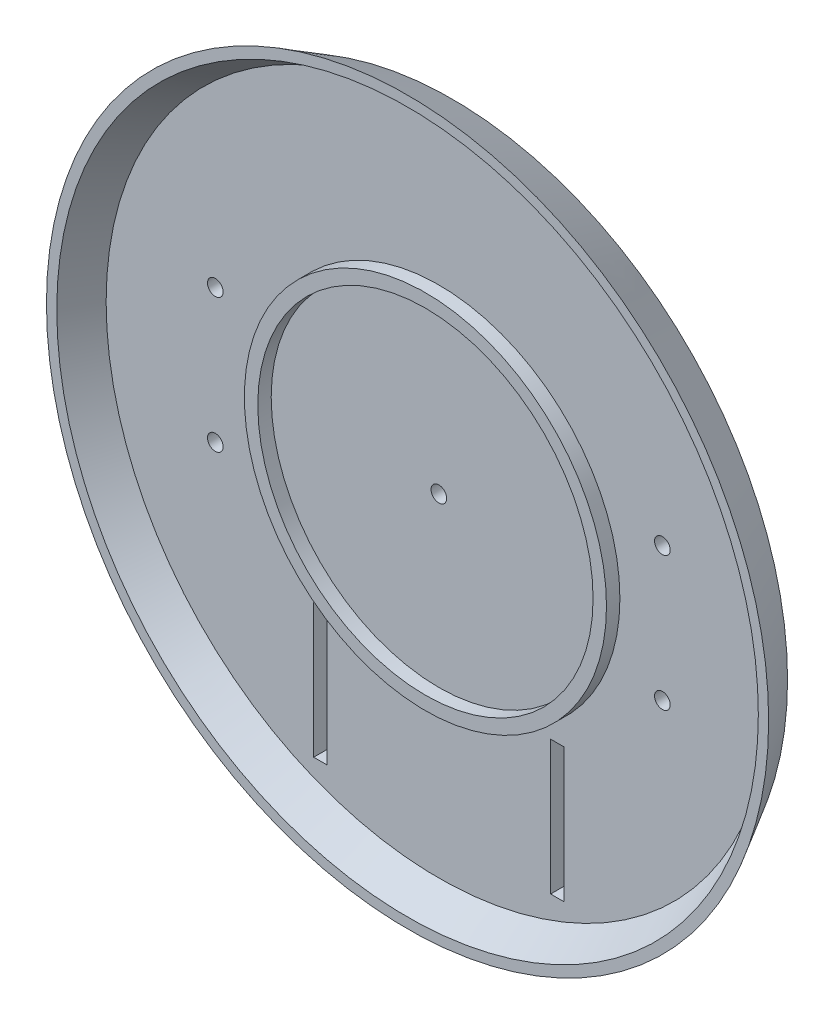
ISO-10303-21;
HEADER;
FILE_DESCRIPTION(('STEP AP214'),'2;1');
FILE_NAME('part.step','',(''),(''),'','','');
FILE_SCHEMA(('AUTOMOTIVE_DESIGN { 1 0 10303 214 1 1 1 1 }'));
ENDSEC;
DATA;
#1=APPLICATION_CONTEXT('core data for automotive mechanical design processes');
#2=APPLICATION_PROTOCOL_DEFINITION('international standard','automotive_design',2000,#1);
#3=PRODUCT_CONTEXT('',#1,'mechanical');
#4=PRODUCT('Part','Part','',(#3));
#5=PRODUCT_RELATED_PRODUCT_CATEGORY('part','',(#4));
#6=PRODUCT_DEFINITION_FORMATION('','',#4);
#7=PRODUCT_DEFINITION_CONTEXT('part definition',#1,'design');
#8=PRODUCT_DEFINITION('design','',#6,#7);
#9=PRODUCT_DEFINITION_SHAPE('','',#8);
#10=(LENGTH_UNIT() NAMED_UNIT(*) SI_UNIT(.MILLI.,.METRE.));
#11=(NAMED_UNIT(*) PLANE_ANGLE_UNIT() SI_UNIT($,.RADIAN.));
#12=(NAMED_UNIT(*) SI_UNIT($,.STERADIAN.) SOLID_ANGLE_UNIT());
#13=UNCERTAINTY_MEASURE_WITH_UNIT(LENGTH_MEASURE(1.E-05),#10,'distance_accuracy_value','');
#14=(GEOMETRIC_REPRESENTATION_CONTEXT(3) GLOBAL_UNCERTAINTY_ASSIGNED_CONTEXT((#13)) GLOBAL_UNIT_ASSIGNED_CONTEXT((#10,
#11,#12)) REPRESENTATION_CONTEXT('',''));
#15=CARTESIAN_POINT('',(0.,0.,0.));
#16=DIRECTION('',(0.,0.,1.));
#17=DIRECTION('',(1.,0.,0.));
#18=AXIS2_PLACEMENT_3D('',#15,#16,#17);
#19=CARTESIAN_POINT('',(0.,0.,3.));
#20=DIRECTION('',(0.,0.,1.));
#21=DIRECTION('',(1.,0.,0.));
#22=AXIS2_PLACEMENT_3D('',#19,#20,#21);
#23=PLANE('',#22);
#24=DIRECTION('',(1.,0.,0.));
#25=VECTOR('',#24,1.);
#26=CARTESIAN_POINT('',(0.,-65.,3.));
#27=LINE('',#26,#25);
#28=CARTESIAN_POINT('',(-28.,-65.,3.));
#29=VERTEX_POINT('',#28);
#30=CARTESIAN_POINT('',(-25.,-65.,3.));
#31=VERTEX_POINT('',#30);
#32=EDGE_CURVE('E158',#29,#31,#27,.T.);
#33=ORIENTED_EDGE('',*,*,#32,.F.);
#34=DIRECTION('',(0.,1.,0.));
#35=VECTOR('',#34,1.);
#36=CARTESIAN_POINT('',(-28.,0.,3.));
#37=LINE('',#36,#35);
#38=CARTESIAN_POINT('',(-28.,-35.,3.));
#39=VERTEX_POINT('',#38);
#40=EDGE_CURVE('E160',#29,#39,#37,.T.);
#41=ORIENTED_EDGE('',*,*,#40,.T.);
#42=DIRECTION('',(1.,0.,0.));
#43=VECTOR('',#42,1.);
#44=CARTESIAN_POINT('',(0.,-35.,3.));
#45=LINE('',#44,#43);
#46=CARTESIAN_POINT('',(-25.,-35.,3.));
#47=VERTEX_POINT('',#46);
#48=EDGE_CURVE('E130',#39,#47,#45,.T.);
#49=ORIENTED_EDGE('',*,*,#48,.T.);
#50=DIRECTION('',(0.,1.,0.));
#51=VECTOR('',#50,1.);
#52=CARTESIAN_POINT('',(-25.,0.,3.));
#53=LINE('',#52,#51);
#54=EDGE_CURVE('E156',#31,#47,#53,.T.);
#55=ORIENTED_EDGE('',*,*,#54,.F.);
#56=EDGE_LOOP('',(#33,#41,#49,#55));
#57=FACE_BOUND('',#56,.T.);
#58=CARTESIAN_POINT('',(-50.,15.,3.));
#59=DIRECTION('',(0.,0.,1.));
#60=DIRECTION('',(1.,0.,0.));
#61=AXIS2_PLACEMENT_3D('',#58,#59,#60);
#62=CIRCLE('',#61,1.75);
#63=CARTESIAN_POINT('',(-48.25,15.,3.));
#64=VERTEX_POINT('',#63);
#65=EDGE_CURVE('E184',#64,#64,#62,.T.);
#66=ORIENTED_EDGE('',*,*,#65,.F.);
#67=EDGE_LOOP('',(#66));
#68=FACE_BOUND('',#67,.T.);
#69=CARTESIAN_POINT('',(-50.,-15.,3.));
#70=DIRECTION('',(0.,0.,1.));
#71=DIRECTION('',(1.,0.,0.));
#72=AXIS2_PLACEMENT_3D('',#69,#70,#71);
#73=CIRCLE('',#72,1.75);
#74=CARTESIAN_POINT('',(-48.25,-15.,3.));
#75=VERTEX_POINT('',#74);
#76=EDGE_CURVE('E181',#75,#75,#73,.T.);
#77=ORIENTED_EDGE('',*,*,#76,.F.);
#78=EDGE_LOOP('',(#77));
#79=FACE_BOUND('',#78,.T.);
#80=CARTESIAN_POINT('',(50.,-15.,3.));
#81=DIRECTION('',(0.,0.,1.));
#82=DIRECTION('',(1.,0.,0.));
#83=AXIS2_PLACEMENT_3D('',#80,#81,#82);
#84=CIRCLE('',#83,1.75);
#85=CARTESIAN_POINT('',(51.75,-15.,3.));
#86=VERTEX_POINT('',#85);
#87=EDGE_CURVE('E188',#86,#86,#84,.T.);
#88=ORIENTED_EDGE('',*,*,#87,.F.);
#89=EDGE_LOOP('',(#88));
#90=FACE_BOUND('',#89,.T.);
#91=CARTESIAN_POINT('',(50.,15.,3.));
#92=DIRECTION('',(0.,0.,1.));
#93=DIRECTION('',(1.,0.,0.));
#94=AXIS2_PLACEMENT_3D('',#91,#92,#93);
#95=CIRCLE('',#94,1.75);
#96=CARTESIAN_POINT('',(51.75,15.,3.));
#97=VERTEX_POINT('',#96);
#98=EDGE_CURVE('E194',#97,#97,#95,.T.);
#99=ORIENTED_EDGE('',*,*,#98,.F.);
#100=EDGE_LOOP('',(#99));
#101=FACE_BOUND('',#100,.T.);
#102=CARTESIAN_POINT('',(0.,0.,3.));
#103=DIRECTION('',(0.,0.,1.));
#104=DIRECTION('',(1.,0.,0.));
#105=AXIS2_PLACEMENT_3D('',#102,#103,#104);
#106=CIRCLE('',#105,40.5);
#107=CARTESIAN_POINT('',(40.5,0.,3.));
#108=VERTEX_POINT('',#107);
#109=EDGE_CURVE('E174',#108,#108,#106,.T.);
#110=ORIENTED_EDGE('',*,*,#109,.F.);
#111=EDGE_LOOP('',(#110));
#112=FACE_BOUND('',#111,.T.);
#113=DIRECTION('',(-1.,0.,0.));
#114=VECTOR('',#113,1.);
#115=CARTESIAN_POINT('',(0.,-35.,3.));
#116=LINE('',#115,#114);
#117=CARTESIAN_POINT('',(28.,-35.,3.));
#118=VERTEX_POINT('',#117);
#119=CARTESIAN_POINT('',(25.,-35.,3.));
#120=VERTEX_POINT('',#119);
#121=EDGE_CURVE('E169',#118,#120,#116,.T.);
#122=ORIENTED_EDGE('',*,*,#121,.F.);
#123=DIRECTION('',(0.,1.,0.));
#124=VECTOR('',#123,1.);
#125=CARTESIAN_POINT('',(28.,0.,3.));
#126=LINE('',#125,#124);
#127=CARTESIAN_POINT('',(28.,-65.,3.));
#128=VERTEX_POINT('',#127);
#129=EDGE_CURVE('E163',#128,#118,#126,.T.);
#130=ORIENTED_EDGE('',*,*,#129,.F.);
#131=DIRECTION('',(-1.,0.,0.));
#132=VECTOR('',#131,1.);
#133=CARTESIAN_POINT('',(0.,-65.,3.));
#134=LINE('',#133,#132);
#135=CARTESIAN_POINT('',(25.,-65.,3.));
#136=VERTEX_POINT('',#135);
#137=EDGE_CURVE('E108',#128,#136,#134,.T.);
#138=ORIENTED_EDGE('',*,*,#137,.T.);
#139=DIRECTION('',(0.,1.,0.));
#140=VECTOR('',#139,1.);
#141=CARTESIAN_POINT('',(25.,0.,3.));
#142=LINE('',#141,#140);
#143=EDGE_CURVE('E166',#136,#120,#142,.T.);
#144=ORIENTED_EDGE('',*,*,#143,.T.);
#145=EDGE_LOOP('',(#122,#130,#138,#144));
#146=FACE_BOUND('',#145,.T.);
#147=CARTESIAN_POINT('',(0.,0.,3.));
#148=DIRECTION('',(0.,0.,1.));
#149=DIRECTION('',(1.,0.,0.));
#150=AXIS2_PLACEMENT_3D('',#147,#148,#149);
#151=CIRCLE('',#150,74.4226497308103);
#152=CARTESIAN_POINT('',(74.4226497308103,0.,3.));
#153=VERTEX_POINT('',#152);
#154=EDGE_CURVE('E11',#153,#153,#151,.F.);
#155=ORIENTED_EDGE('',*,*,#154,.F.);
#156=EDGE_LOOP('',(#155));
#157=FACE_BOUND('',#156,.T.);
#158=ADVANCED_FACE('F37',(#57,#68,#79,#90,#101,#112,#146,#157),#23,.T.);
#159=CARTESIAN_POINT('',(0.,0.,0.));
#160=DIRECTION('',(0.,0.,1.));
#161=DIRECTION('',(1.,0.,0.));
#162=AXIS2_PLACEMENT_3D('',#159,#160,#161);
#163=PLANE('',#162);
#164=CARTESIAN_POINT('',(0.,0.,0.));
#165=DIRECTION('',(0.,0.,1.));
#166=DIRECTION('',(1.,0.,0.));
#167=AXIS2_PLACEMENT_3D('',#164,#165,#166);
#168=CIRCLE('',#167,75.);
#169=CARTESIAN_POINT('',(75.,0.,0.));
#170=VERTEX_POINT('',#169);
#171=EDGE_CURVE('E208',#170,#170,#168,.T.);
#172=ORIENTED_EDGE('',*,*,#171,.F.);
#173=EDGE_LOOP('',(#172));
#174=FACE_BOUND('',#173,.T.);
#175=DIRECTION('',(0.,-1.,0.));
#176=VECTOR('',#175,1.);
#177=CARTESIAN_POINT('',(-28.,0.,0.));
#178=LINE('',#177,#176);
#179=CARTESIAN_POINT('',(-28.,-35.,0.));
#180=VERTEX_POINT('',#179);
#181=CARTESIAN_POINT('',(-28.,-65.,0.));
#182=VERTEX_POINT('',#181);
#183=EDGE_CURVE('E133',#180,#182,#178,.T.);
#184=ORIENTED_EDGE('',*,*,#183,.T.);
#185=DIRECTION('',(-1.,0.,0.));
#186=VECTOR('',#185,1.);
#187=CARTESIAN_POINT('',(0.,-65.,0.));
#188=LINE('',#187,#186);
#189=CARTESIAN_POINT('',(-25.,-65.,0.));
#190=VERTEX_POINT('',#189);
#191=EDGE_CURVE('E143',#190,#182,#188,.T.);
#192=ORIENTED_EDGE('',*,*,#191,.F.);
#193=DIRECTION('',(0.,-1.,0.));
#194=VECTOR('',#193,1.);
#195=CARTESIAN_POINT('',(-25.,0.,0.));
#196=LINE('',#195,#194);
#197=CARTESIAN_POINT('',(-25.,-35.,0.));
#198=VERTEX_POINT('',#197);
#199=EDGE_CURVE('E140',#198,#190,#196,.T.);
#200=ORIENTED_EDGE('',*,*,#199,.F.);
#201=DIRECTION('',(-1.,0.,0.));
#202=VECTOR('',#201,1.);
#203=CARTESIAN_POINT('',(0.,-35.,0.));
#204=LINE('',#203,#202);
#205=EDGE_CURVE('E136',#198,#180,#204,.T.);
#206=ORIENTED_EDGE('',*,*,#205,.T.);
#207=EDGE_LOOP('',(#184,#192,#200,#206));
#208=FACE_BOUND('',#207,.T.);
#209=CARTESIAN_POINT('',(0.,0.,0.));
#210=DIRECTION('',(0.,0.,1.));
#211=DIRECTION('',(1.,0.,0.));
#212=AXIS2_PLACEMENT_3D('',#209,#210,#211);
#213=CIRCLE('',#212,1.75);
#214=CARTESIAN_POINT('',(1.74999999999999,0.,0.));
#215=VERTEX_POINT('',#214);
#216=EDGE_CURVE('E178',#215,#215,#213,.T.);
#217=ORIENTED_EDGE('',*,*,#216,.T.);
#218=EDGE_LOOP('',(#217));
#219=FACE_BOUND('',#218,.T.);
#220=CARTESIAN_POINT('',(50.,15.,0.));
#221=DIRECTION('',(0.,0.,1.));
#222=DIRECTION('',(1.,0.,0.));
#223=AXIS2_PLACEMENT_3D('',#220,#221,#222);
#224=CIRCLE('',#223,1.75);
#225=CARTESIAN_POINT('',(51.75,15.,0.));
#226=VERTEX_POINT('',#225);
#227=EDGE_CURVE('E197',#226,#226,#224,.T.);
#228=ORIENTED_EDGE('',*,*,#227,.T.);
#229=EDGE_LOOP('',(#228));
#230=FACE_BOUND('',#229,.T.);
#231=CARTESIAN_POINT('',(50.,-15.,0.));
#232=DIRECTION('',(0.,0.,1.));
#233=DIRECTION('',(1.,0.,0.));
#234=AXIS2_PLACEMENT_3D('',#231,#232,#233);
#235=CIRCLE('',#234,1.75);
#236=CARTESIAN_POINT('',(51.75,-15.,0.));
#237=VERTEX_POINT('',#236);
#238=EDGE_CURVE('E191',#237,#237,#235,.T.);
#239=ORIENTED_EDGE('',*,*,#238,.T.);
#240=EDGE_LOOP('',(#239));
#241=FACE_BOUND('',#240,.T.);
#242=CARTESIAN_POINT('',(-50.,-15.,0.));
#243=DIRECTION('',(0.,0.,1.));
#244=DIRECTION('',(1.,0.,0.));
#245=AXIS2_PLACEMENT_3D('',#242,#243,#244);
#246=CIRCLE('',#245,1.75);
#247=CARTESIAN_POINT('',(-48.25,-15.,0.));
#248=VERTEX_POINT('',#247);
#249=EDGE_CURVE('E185',#248,#248,#246,.T.);
#250=ORIENTED_EDGE('',*,*,#249,.T.);
#251=EDGE_LOOP('',(#250));
#252=FACE_BOUND('',#251,.T.);
#253=CARTESIAN_POINT('',(-50.,15.,0.));
#254=DIRECTION('',(0.,0.,1.));
#255=DIRECTION('',(1.,0.,0.));
#256=AXIS2_PLACEMENT_3D('',#253,#254,#255);
#257=CIRCLE('',#256,1.75);
#258=CARTESIAN_POINT('',(-48.25,15.,0.));
#259=VERTEX_POINT('',#258);
#260=EDGE_CURVE('E205',#259,#259,#257,.T.);
#261=ORIENTED_EDGE('',*,*,#260,.T.);
#262=EDGE_LOOP('',(#261));
#263=FACE_BOUND('',#262,.T.);
#264=DIRECTION('',(0.,-1.,0.));
#265=VECTOR('',#264,1.);
#266=CARTESIAN_POINT('',(28.,0.,0.));
#267=LINE('',#266,#265);
#268=CARTESIAN_POINT('',(28.,-35.,0.));
#269=VERTEX_POINT('',#268);
#270=CARTESIAN_POINT('',(28.,-65.,0.));
#271=VERTEX_POINT('',#270);
#272=EDGE_CURVE('E115',#269,#271,#267,.T.);
#273=ORIENTED_EDGE('',*,*,#272,.F.);
#274=DIRECTION('',(1.,0.,0.));
#275=VECTOR('',#274,1.);
#276=CARTESIAN_POINT('',(0.,-35.,0.));
#277=LINE('',#276,#275);
#278=CARTESIAN_POINT('',(25.,-35.,0.));
#279=VERTEX_POINT('',#278);
#280=EDGE_CURVE('E120',#279,#269,#277,.T.);
#281=ORIENTED_EDGE('',*,*,#280,.F.);
#282=DIRECTION('',(0.,-1.,0.));
#283=VECTOR('',#282,1.);
#284=CARTESIAN_POINT('',(25.,0.,0.));
#285=LINE('',#284,#283);
#286=CARTESIAN_POINT('',(25.,-65.,0.));
#287=VERTEX_POINT('',#286);
#288=EDGE_CURVE('E123',#279,#287,#285,.T.);
#289=ORIENTED_EDGE('',*,*,#288,.T.);
#290=DIRECTION('',(1.,0.,0.));
#291=VECTOR('',#290,1.);
#292=CARTESIAN_POINT('',(0.,-65.,0.));
#293=LINE('',#292,#291);
#294=EDGE_CURVE('E105',#287,#271,#293,.T.);
#295=ORIENTED_EDGE('',*,*,#294,.T.);
#296=EDGE_LOOP('',(#273,#281,#289,#295));
#297=FACE_BOUND('',#296,.T.);
#298=ADVANCED_FACE('F39',(#174,#208,#219,#230,#241,#252,#263,#297),#163,.F.);
#299=CARTESIAN_POINT('',(0.,0.,3.));
#300=DIRECTION('',(0.,0.,1.));
#301=DIRECTION('',(1.,0.,0.));
#302=AXIS2_PLACEMENT_3D('',#299,#300,#301);
#303=CIRCLE('',#302,1.75);
#304=CARTESIAN_POINT('',(1.74999999999999,0.,3.));
#305=VERTEX_POINT('',#304);
#306=EDGE_CURVE('E200',#305,#305,#303,.T.);
#307=ORIENTED_EDGE('',*,*,#306,.F.);
#308=EDGE_LOOP('',(#307));
#309=FACE_BOUND('',#308,.T.);
#310=CARTESIAN_POINT('',(0.,0.,3.));
#311=DIRECTION('',(0.,0.,1.));
#312=DIRECTION('',(1.,0.,0.));
#313=AXIS2_PLACEMENT_3D('',#310,#311,#312);
#314=CIRCLE('',#313,37.5);
#315=CARTESIAN_POINT('',(37.5,0.,3.));
#316=VERTEX_POINT('',#315);
#317=EDGE_CURVE('E41',#316,#316,#314,.F.);
#318=ORIENTED_EDGE('',*,*,#317,.F.);
#319=EDGE_LOOP('',(#318));
#320=FACE_BOUND('',#319,.T.);
#321=ADVANCED_FACE('F218',(#309,#320),#23,.T.);
#322=CARTESIAN_POINT('',(-50.,15.,0.));
#323=DIRECTION('',(0.,0.,1.));
#324=DIRECTION('',(1.,0.,0.));
#325=AXIS2_PLACEMENT_3D('',#322,#323,#324);
#326=CYLINDRICAL_SURFACE('',#325,1.75);
#327=ORIENTED_EDGE('',*,*,#260,.F.);
#328=EDGE_LOOP('',(#327));
#329=FACE_BOUND('',#328,.T.);
#330=ORIENTED_EDGE('',*,*,#65,.T.);
#331=EDGE_LOOP('',(#330));
#332=FACE_BOUND('',#331,.T.);
#333=ADVANCED_FACE('F220',(#329,#332),#326,.F.);
#334=CARTESIAN_POINT('',(-50.,-15.,0.));
#335=DIRECTION('',(0.,0.,1.));
#336=DIRECTION('',(1.,0.,0.));
#337=AXIS2_PLACEMENT_3D('',#334,#335,#336);
#338=CYLINDRICAL_SURFACE('',#337,1.75);
#339=ORIENTED_EDGE('',*,*,#249,.F.);
#340=EDGE_LOOP('',(#339));
#341=FACE_BOUND('',#340,.T.);
#342=ORIENTED_EDGE('',*,*,#76,.T.);
#343=EDGE_LOOP('',(#342));
#344=FACE_BOUND('',#343,.T.);
#345=ADVANCED_FACE('F226',(#341,#344),#338,.F.);
#346=CARTESIAN_POINT('',(50.,-15.,0.));
#347=DIRECTION('',(0.,0.,1.));
#348=DIRECTION('',(1.,0.,0.));
#349=AXIS2_PLACEMENT_3D('',#346,#347,#348);
#350=CYLINDRICAL_SURFACE('',#349,1.75);
#351=ORIENTED_EDGE('',*,*,#238,.F.);
#352=EDGE_LOOP('',(#351));
#353=FACE_BOUND('',#352,.T.);
#354=ORIENTED_EDGE('',*,*,#87,.T.);
#355=EDGE_LOOP('',(#354));
#356=FACE_BOUND('',#355,.T.);
#357=ADVANCED_FACE('F314',(#353,#356),#350,.F.);
#358=CARTESIAN_POINT('',(50.,15.,0.));
#359=DIRECTION('',(0.,0.,1.));
#360=DIRECTION('',(1.,0.,0.));
#361=AXIS2_PLACEMENT_3D('',#358,#359,#360);
#362=CYLINDRICAL_SURFACE('',#361,1.75);
#363=ORIENTED_EDGE('',*,*,#227,.F.);
#364=EDGE_LOOP('',(#363));
#365=FACE_BOUND('',#364,.T.);
#366=ORIENTED_EDGE('',*,*,#98,.T.);
#367=EDGE_LOOP('',(#366));
#368=FACE_BOUND('',#367,.T.);
#369=ADVANCED_FACE('F318',(#365,#368),#362,.F.);
#370=CARTESIAN_POINT('',(0.,0.,0.));
#371=DIRECTION('',(0.,0.,1.));
#372=DIRECTION('',(1.,0.,0.));
#373=AXIS2_PLACEMENT_3D('',#370,#371,#372);
#374=CYLINDRICAL_SURFACE('',#373,1.75);
#375=ORIENTED_EDGE('',*,*,#216,.F.);
#376=EDGE_LOOP('',(#375));
#377=FACE_BOUND('',#376,.T.);
#378=ORIENTED_EDGE('',*,*,#306,.T.);
#379=EDGE_LOOP('',(#378));
#380=FACE_BOUND('',#379,.T.);
#381=ADVANCED_FACE('F307',(#377,#380),#374,.F.);
#382=CARTESIAN_POINT('',(0.,0.,6.));
#383=DIRECTION('',(0.,0.,1.));
#384=DIRECTION('',(1.,0.,0.));
#385=AXIS2_PLACEMENT_3D('',#382,#383,#384);
#386=PLANE('',#385);
#387=CARTESIAN_POINT('',(0.,0.,6.));
#388=DIRECTION('',(0.,0.,1.));
#389=DIRECTION('',(1.,0.,0.));
#390=AXIS2_PLACEMENT_3D('',#387,#388,#389);
#391=CIRCLE('',#390,40.5);
#392=CARTESIAN_POINT('',(40.5,0.,6.));
#393=VERTEX_POINT('',#392);
#394=EDGE_CURVE('E175',#393,#393,#391,.T.);
#395=ORIENTED_EDGE('',*,*,#394,.T.);
#396=EDGE_LOOP('',(#395));
#397=FACE_BOUND('',#396,.T.);
#398=CARTESIAN_POINT('',(0.,0.,6.));
#399=DIRECTION('',(0.,0.,1.));
#400=DIRECTION('',(1.,0.,0.));
#401=AXIS2_PLACEMENT_3D('',#398,#399,#400);
#402=CIRCLE('',#401,37.5);
#403=CARTESIAN_POINT('',(37.5,0.,6.));
#404=VERTEX_POINT('',#403);
#405=EDGE_CURVE('E171',#404,#404,#402,.T.);
#406=ORIENTED_EDGE('',*,*,#405,.F.);
#407=EDGE_LOOP('',(#406));
#408=FACE_BOUND('',#407,.T.);
#409=ADVANCED_FACE('F304',(#397,#408),#386,.T.);
#410=CARTESIAN_POINT('',(0.,0.,6.));
#411=DIRECTION('',(0.,0.,-1.));
#412=DIRECTION('',(-1.,0.,0.));
#413=AXIS2_PLACEMENT_3D('',#410,#411,#412);
#414=CYLINDRICAL_SURFACE('',#413,40.5);
#415=ORIENTED_EDGE('',*,*,#394,.F.);
#416=EDGE_LOOP('',(#415));
#417=FACE_BOUND('',#416,.T.);
#418=ORIENTED_EDGE('',*,*,#109,.T.);
#419=EDGE_LOOP('',(#418));
#420=FACE_BOUND('',#419,.T.);
#421=ADVANCED_FACE('F302',(#417,#420),#414,.T.);
#422=CARTESIAN_POINT('',(0.,0.,6.));
#423=DIRECTION('',(0.,0.,-1.));
#424=DIRECTION('',(-1.,0.,0.));
#425=AXIS2_PLACEMENT_3D('',#422,#423,#424);
#426=CYLINDRICAL_SURFACE('',#425,37.5);
#427=ORIENTED_EDGE('',*,*,#405,.T.);
#428=EDGE_LOOP('',(#427));
#429=FACE_BOUND('',#428,.T.);
#430=ORIENTED_EDGE('',*,*,#317,.T.);
#431=EDGE_LOOP('',(#430));
#432=FACE_BOUND('',#431,.T.);
#433=ADVANCED_FACE('F216',(#429,#432),#426,.F.);
#434=CARTESIAN_POINT('',(-28.,0.,6.));
#435=DIRECTION('',(1.,0.,0.));
#436=DIRECTION('',(0.,1.,0.));
#437=AXIS2_PLACEMENT_3D('',#434,#435,#436);
#438=PLANE('',#437);
#439=DIRECTION('',(0.,0.,-1.));
#440=VECTOR('',#439,1.);
#441=CARTESIAN_POINT('',(-28.,-65.,6.));
#442=LINE('',#441,#440);
#443=EDGE_CURVE('E147',#29,#182,#442,.T.);
#444=ORIENTED_EDGE('',*,*,#443,.T.);
#445=ORIENTED_EDGE('',*,*,#183,.F.);
#446=DIRECTION('',(0.,0.,-1.));
#447=VECTOR('',#446,1.);
#448=CARTESIAN_POINT('',(-28.,-35.,6.));
#449=LINE('',#448,#447);
#450=EDGE_CURVE('E146',#39,#180,#449,.T.);
#451=ORIENTED_EDGE('',*,*,#450,.F.);
#452=ORIENTED_EDGE('',*,*,#40,.F.);
#453=EDGE_LOOP('',(#444,#445,#451,#452));
#454=FACE_BOUND('',#453,.T.);
#455=ADVANCED_FACE('F290',(#454),#438,.T.);
#456=CARTESIAN_POINT('',(0.,-65.,6.));
#457=DIRECTION('',(0.,-1.,0.));
#458=DIRECTION('',(0.,0.,-1.));
#459=AXIS2_PLACEMENT_3D('',#456,#457,#458);
#460=PLANE('',#459);
#461=ORIENTED_EDGE('',*,*,#32,.T.);
#462=DIRECTION('',(0.,0.,-1.));
#463=VECTOR('',#462,1.);
#464=CARTESIAN_POINT('',(-25.,-65.,6.));
#465=LINE('',#464,#463);
#466=EDGE_CURVE('E149',#31,#190,#465,.T.);
#467=ORIENTED_EDGE('',*,*,#466,.T.);
#468=ORIENTED_EDGE('',*,*,#191,.T.);
#469=ORIENTED_EDGE('',*,*,#443,.F.);
#470=EDGE_LOOP('',(#461,#467,#468,#469));
#471=FACE_BOUND('',#470,.T.);
#472=ADVANCED_FACE('F286',(#471),#460,.F.);
#473=CARTESIAN_POINT('',(-25.,0.,6.));
#474=DIRECTION('',(1.,0.,0.));
#475=DIRECTION('',(0.,1.,0.));
#476=AXIS2_PLACEMENT_3D('',#473,#474,#475);
#477=PLANE('',#476);
#478=ORIENTED_EDGE('',*,*,#54,.T.);
#479=DIRECTION('',(0.,0.,-1.));
#480=VECTOR('',#479,1.);
#481=CARTESIAN_POINT('',(-25.,-35.,6.));
#482=LINE('',#481,#480);
#483=EDGE_CURVE('E61',#47,#198,#482,.T.);
#484=ORIENTED_EDGE('',*,*,#483,.T.);
#485=ORIENTED_EDGE('',*,*,#199,.T.);
#486=ORIENTED_EDGE('',*,*,#466,.F.);
#487=EDGE_LOOP('',(#478,#484,#485,#486));
#488=FACE_BOUND('',#487,.T.);
#489=ADVANCED_FACE('F289',(#488),#477,.F.);
#490=CARTESIAN_POINT('',(0.,-35.,6.));
#491=DIRECTION('',(0.,-1.,0.));
#492=DIRECTION('',(0.,0.,-1.));
#493=AXIS2_PLACEMENT_3D('',#490,#491,#492);
#494=PLANE('',#493);
#495=ORIENTED_EDGE('',*,*,#450,.T.);
#496=ORIENTED_EDGE('',*,*,#205,.F.);
#497=ORIENTED_EDGE('',*,*,#483,.F.);
#498=ORIENTED_EDGE('',*,*,#48,.F.);
#499=EDGE_LOOP('',(#495,#496,#497,#498));
#500=FACE_BOUND('',#499,.T.);
#501=ADVANCED_FACE('F278',(#500),#494,.T.);
#502=CARTESIAN_POINT('',(0.,-35.,6.));
#503=DIRECTION('',(0.,1.,0.));
#504=DIRECTION('',(0.,0.,1.));
#505=AXIS2_PLACEMENT_3D('',#502,#503,#504);
#506=PLANE('',#505);
#507=ORIENTED_EDGE('',*,*,#121,.T.);
#508=DIRECTION('',(0.,0.,-1.));
#509=VECTOR('',#508,1.);
#510=CARTESIAN_POINT('',(25.,-35.,6.));
#511=LINE('',#510,#509);
#512=EDGE_CURVE('E128',#120,#279,#511,.T.);
#513=ORIENTED_EDGE('',*,*,#512,.T.);
#514=ORIENTED_EDGE('',*,*,#280,.T.);
#515=DIRECTION('',(0.,0.,-1.));
#516=VECTOR('',#515,1.);
#517=CARTESIAN_POINT('',(28.,-35.,6.));
#518=LINE('',#517,#516);
#519=EDGE_CURVE('E111',#118,#269,#518,.T.);
#520=ORIENTED_EDGE('',*,*,#519,.F.);
#521=EDGE_LOOP('',(#507,#513,#514,#520));
#522=FACE_BOUND('',#521,.T.);
#523=ADVANCED_FACE('F267',(#522),#506,.F.);
#524=CARTESIAN_POINT('',(25.,0.,6.));
#525=DIRECTION('',(1.,0.,0.));
#526=DIRECTION('',(0.,1.,0.));
#527=AXIS2_PLACEMENT_3D('',#524,#525,#526);
#528=PLANE('',#527);
#529=DIRECTION('',(0.,0.,-1.));
#530=VECTOR('',#529,1.);
#531=CARTESIAN_POINT('',(25.,-65.,6.));
#532=LINE('',#531,#530);
#533=EDGE_CURVE('E110',#136,#287,#532,.T.);
#534=ORIENTED_EDGE('',*,*,#533,.T.);
#535=ORIENTED_EDGE('',*,*,#288,.F.);
#536=ORIENTED_EDGE('',*,*,#512,.F.);
#537=ORIENTED_EDGE('',*,*,#143,.F.);
#538=EDGE_LOOP('',(#534,#535,#536,#537));
#539=FACE_BOUND('',#538,.T.);
#540=ADVANCED_FACE('F270',(#539),#528,.T.);
#541=CARTESIAN_POINT('',(0.,-65.,6.));
#542=DIRECTION('',(0.,1.,0.));
#543=DIRECTION('',(0.,0.,1.));
#544=AXIS2_PLACEMENT_3D('',#541,#542,#543);
#545=PLANE('',#544);
#546=DIRECTION('',(0.,0.,-1.));
#547=VECTOR('',#546,1.);
#548=CARTESIAN_POINT('',(28.,-65.,6.));
#549=LINE('',#548,#547);
#550=EDGE_CURVE('E53',#128,#271,#549,.T.);
#551=ORIENTED_EDGE('',*,*,#550,.T.);
#552=ORIENTED_EDGE('',*,*,#294,.F.);
#553=ORIENTED_EDGE('',*,*,#533,.F.);
#554=ORIENTED_EDGE('',*,*,#137,.F.);
#555=EDGE_LOOP('',(#551,#552,#553,#554));
#556=FACE_BOUND('',#555,.T.);
#557=ADVANCED_FACE('F102',(#556),#545,.T.);
#558=CARTESIAN_POINT('',(28.,0.,6.));
#559=DIRECTION('',(1.,0.,0.));
#560=DIRECTION('',(0.,1.,0.));
#561=AXIS2_PLACEMENT_3D('',#558,#559,#560);
#562=PLANE('',#561);
#563=ORIENTED_EDGE('',*,*,#129,.T.);
#564=ORIENTED_EDGE('',*,*,#519,.T.);
#565=ORIENTED_EDGE('',*,*,#272,.T.);
#566=ORIENTED_EDGE('',*,*,#550,.F.);
#567=EDGE_LOOP('',(#563,#564,#565,#566));
#568=FACE_BOUND('',#567,.T.);
#569=ADVANCED_FACE('F116',(#568),#562,.F.);
#570=CARTESIAN_POINT('',(0.,0.,0.));
#571=DIRECTION('',(0.,0.,1.));
#572=DIRECTION('',(1.,0.,0.));
#573=AXIS2_PLACEMENT_3D('',#570,#571,#572);
#574=CONICAL_SURFACE('',#573,75.,0.523598775598296);
#575=CARTESIAN_POINT('',(0.,0.,10.));
#576=DIRECTION('',(0.,0.,-1.));
#577=DIRECTION('',(-1.,0.,0.));
#578=AXIS2_PLACEMENT_3D('',#575,#576,#577);
#579=CIRCLE('',#578,80.7735026918962);
#580=CARTESIAN_POINT('',(-80.7735026918962,0.,10.));
#581=VERTEX_POINT('',#580);
#582=EDGE_CURVE('E137',#581,#581,#579,.T.);
#583=ORIENTED_EDGE('',*,*,#582,.T.);
#584=EDGE_LOOP('',(#583));
#585=FACE_BOUND('',#584,.T.);
#586=ORIENTED_EDGE('',*,*,#171,.T.);
#587=EDGE_LOOP('',(#586));
#588=FACE_BOUND('',#587,.T.);
#589=ADVANCED_FACE('F281',(#585,#588),#574,.T.);
#590=CARTESIAN_POINT('',(-80.7735026918962,0.,10.));
#591=DIRECTION('',(0.,0.,1.));
#592=DIRECTION('',(1.,0.,0.));
#593=AXIS2_PLACEMENT_3D('',#590,#591,#592);
#594=PLANE('',#593);
#595=CARTESIAN_POINT('',(0.,0.,10.));
#596=DIRECTION('',(0.,0.,-1.));
#597=DIRECTION('',(-1.,0.,0.));
#598=AXIS2_PLACEMENT_3D('',#595,#596,#597);
#599=CIRCLE('',#598,78.4641016151377);
#600=CARTESIAN_POINT('',(-78.4641016151377,0.,10.));
#601=VERTEX_POINT('',#600);
#602=EDGE_CURVE('E261',#601,#601,#599,.T.);
#603=ORIENTED_EDGE('',*,*,#602,.T.);
#604=EDGE_LOOP('',(#603));
#605=FACE_BOUND('',#604,.T.);
#606=ORIENTED_EDGE('',*,*,#582,.F.);
#607=EDGE_LOOP('',(#606));
#608=FACE_BOUND('',#607,.T.);
#609=ADVANCED_FACE('F257',(#605,#608),#594,.T.);
#610=CARTESIAN_POINT('',(0.,0.,10.));
#611=DIRECTION('',(0.,0.,1.));
#612=DIRECTION('',(1.,0.,0.));
#613=AXIS2_PLACEMENT_3D('',#610,#611,#612);
#614=CONICAL_SURFACE('',#613,78.4641016151377,0.523598775598296);
#615=ORIENTED_EDGE('',*,*,#154,.T.);
#616=EDGE_LOOP('',(#615));
#617=FACE_BOUND('',#616,.T.);
#618=ORIENTED_EDGE('',*,*,#602,.F.);
#619=EDGE_LOOP('',(#618));
#620=FACE_BOUND('',#619,.T.);
#621=ADVANCED_FACE('F254',(#617,#620),#614,.F.);
#622=CLOSED_SHELL('',(#158,#298,#321,#333,#345,#357,#369,#381,#409,#421,#433,#455,#472,#489,
#501,#523,#540,#557,#569,#589,#609,#621));
#623=MANIFOLD_SOLID_BREP('B2',#622);
#624=ADVANCED_BREP_SHAPE_REPRESENTATION('',(#18,#623),#14);
#625=SHAPE_DEFINITION_REPRESENTATION(#9,#624);
ENDSEC;
END-ISO-10303-21;
